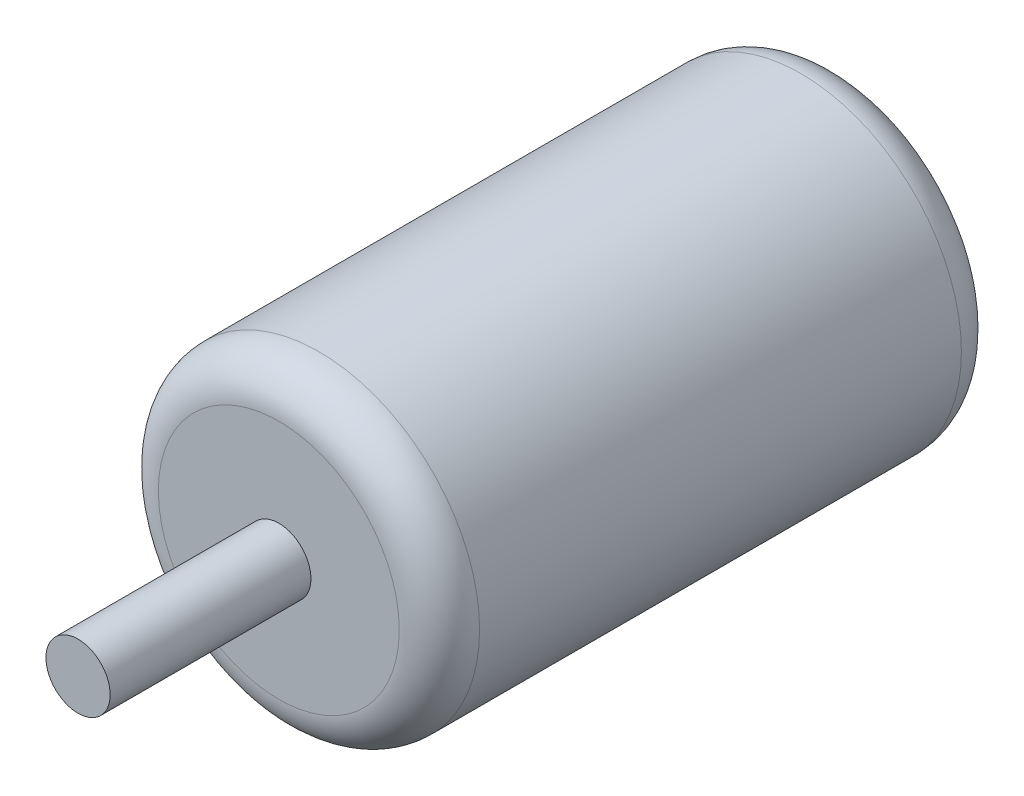
ISO-10303-21;
HEADER;
FILE_DESCRIPTION(('STEP AP214'),'2;1');
FILE_NAME('part.step','',(''),(''),'','','');
FILE_SCHEMA(('AUTOMOTIVE_DESIGN { 1 0 10303 214 1 1 1 1 }'));
ENDSEC;
DATA;
#1=APPLICATION_CONTEXT('core data for automotive mechanical design processes');
#2=APPLICATION_PROTOCOL_DEFINITION('international standard','automotive_design',2000,#1);
#3=PRODUCT_CONTEXT('',#1,'mechanical');
#4=PRODUCT('Part','Part','',(#3));
#5=PRODUCT_RELATED_PRODUCT_CATEGORY('part','',(#4));
#6=PRODUCT_DEFINITION_FORMATION('','',#4);
#7=PRODUCT_DEFINITION_CONTEXT('part definition',#1,'design');
#8=PRODUCT_DEFINITION('design','',#6,#7);
#9=PRODUCT_DEFINITION_SHAPE('','',#8);
#10=(LENGTH_UNIT() NAMED_UNIT(*) SI_UNIT(.MILLI.,.METRE.));
#11=(NAMED_UNIT(*) PLANE_ANGLE_UNIT() SI_UNIT($,.RADIAN.));
#12=(NAMED_UNIT(*) SI_UNIT($,.STERADIAN.) SOLID_ANGLE_UNIT());
#13=UNCERTAINTY_MEASURE_WITH_UNIT(LENGTH_MEASURE(1.E-05),#10,'distance_accuracy_value','');
#14=(GEOMETRIC_REPRESENTATION_CONTEXT(3) GLOBAL_UNCERTAINTY_ASSIGNED_CONTEXT((#13)) GLOBAL_UNIT_ASSIGNED_CONTEXT((#10,
#11,#12)) REPRESENTATION_CONTEXT('',''));
#15=CARTESIAN_POINT('',(0.,0.,0.));
#16=DIRECTION('',(0.,0.,1.));
#17=DIRECTION('',(1.,0.,0.));
#18=AXIS2_PLACEMENT_3D('',#15,#16,#17);
#19=CARTESIAN_POINT('',(0.,0.,70.));
#20=DIRECTION('',(0.,0.,-1.));
#21=DIRECTION('',(-1.,0.,0.));
#22=AXIS2_PLACEMENT_3D('',#19,#20,#21);
#23=CYLINDRICAL_SURFACE('',#22,20.);
#24=CARTESIAN_POINT('',(0.,0.,5.));
#25=DIRECTION('',(0.,0.,1.));
#26=DIRECTION('',(1.,0.,0.));
#27=AXIS2_PLACEMENT_3D('',#24,#25,#26);
#28=CIRCLE('',#27,20.);
#29=CARTESIAN_POINT('',(20.,0.,5.));
#30=VERTEX_POINT('',#29);
#31=EDGE_CURVE('E42',#30,#30,#28,.T.);
#32=ORIENTED_EDGE('',*,*,#31,.T.);
#33=EDGE_LOOP('',(#32));
#34=FACE_BOUND('',#33,.T.);
#35=CARTESIAN_POINT('',(0.,0.,65.));
#36=DIRECTION('',(0.,0.,1.));
#37=DIRECTION('',(1.,0.,0.));
#38=AXIS2_PLACEMENT_3D('',#35,#36,#37);
#39=CIRCLE('',#38,20.);
#40=CARTESIAN_POINT('',(20.,0.,65.));
#41=VERTEX_POINT('',#40);
#42=EDGE_CURVE('E46',#41,#41,#39,.F.);
#43=ORIENTED_EDGE('',*,*,#42,.T.);
#44=EDGE_LOOP('',(#43));
#45=FACE_BOUND('',#44,.T.);
#46=ADVANCED_FACE('F31',(#34,#45),#23,.T.);
#47=CARTESIAN_POINT('',(0.,0.,70.));
#48=DIRECTION('',(0.,0.,1.));
#49=DIRECTION('',(1.,0.,0.));
#50=AXIS2_PLACEMENT_3D('',#47,#48,#49);
#51=PLANE('',#50);
#52=CARTESIAN_POINT('',(0.,0.,70.));
#53=DIRECTION('',(0.,0.,1.));
#54=DIRECTION('',(1.,0.,0.));
#55=AXIS2_PLACEMENT_3D('',#52,#53,#54);
#56=CIRCLE('',#55,15.);
#57=CARTESIAN_POINT('',(15.,0.,70.));
#58=VERTEX_POINT('',#57);
#59=EDGE_CURVE('E10',#58,#58,#56,.T.);
#60=ORIENTED_EDGE('',*,*,#59,.T.);
#61=EDGE_LOOP('',(#60));
#62=FACE_BOUND('',#61,.T.);
#63=CARTESIAN_POINT('',(0.,0.,70.));
#64=DIRECTION('',(0.,0.,1.));
#65=DIRECTION('',(1.,0.,0.));
#66=AXIS2_PLACEMENT_3D('',#63,#64,#65);
#67=CIRCLE('',#66,4.);
#68=CARTESIAN_POINT('',(4.,0.,70.));
#69=VERTEX_POINT('',#68);
#70=EDGE_CURVE('E51',#69,#69,#67,.T.);
#71=ORIENTED_EDGE('',*,*,#70,.F.);
#72=EDGE_LOOP('',(#71));
#73=FACE_BOUND('',#72,.T.);
#74=ADVANCED_FACE('F67',(#62,#73),#51,.T.);
#75=CARTESIAN_POINT('',(0.,0.,0.));
#76=DIRECTION('',(0.,0.,1.));
#77=DIRECTION('',(1.,0.,0.));
#78=AXIS2_PLACEMENT_3D('',#75,#76,#77);
#79=PLANE('',#78);
#80=CARTESIAN_POINT('',(0.,0.,0.));
#81=DIRECTION('',(0.,0.,1.));
#82=DIRECTION('',(1.,0.,0.));
#83=AXIS2_PLACEMENT_3D('',#80,#81,#82);
#84=CIRCLE('',#83,15.);
#85=CARTESIAN_POINT('',(15.,0.,0.));
#86=VERTEX_POINT('',#85);
#87=EDGE_CURVE('E38',#86,#86,#84,.F.);
#88=ORIENTED_EDGE('',*,*,#87,.T.);
#89=EDGE_LOOP('',(#88));
#90=FACE_BOUND('',#89,.T.);
#91=ADVANCED_FACE('F63',(#90),#79,.F.);
#92=CARTESIAN_POINT('',(0.,0.,95.));
#93=DIRECTION('',(0.,0.,-1.));
#94=DIRECTION('',(-1.,0.,0.));
#95=AXIS2_PLACEMENT_3D('',#92,#93,#94);
#96=CYLINDRICAL_SURFACE('',#95,4.);
#97=CARTESIAN_POINT('',(0.,0.,95.));
#98=DIRECTION('',(0.,0.,1.));
#99=DIRECTION('',(1.,0.,0.));
#100=AXIS2_PLACEMENT_3D('',#97,#98,#99);
#101=CIRCLE('',#100,4.);
#102=CARTESIAN_POINT('',(4.,0.,95.));
#103=VERTEX_POINT('',#102);
#104=EDGE_CURVE('E54',#103,#103,#101,.T.);
#105=ORIENTED_EDGE('',*,*,#104,.F.);
#106=EDGE_LOOP('',(#105));
#107=FACE_BOUND('',#106,.T.);
#108=ORIENTED_EDGE('',*,*,#70,.T.);
#109=EDGE_LOOP('',(#108));
#110=FACE_BOUND('',#109,.T.);
#111=ADVANCED_FACE('F60',(#107,#110),#96,.T.);
#112=CARTESIAN_POINT('',(0.,0.,95.));
#113=DIRECTION('',(0.,0.,1.));
#114=DIRECTION('',(1.,0.,0.));
#115=AXIS2_PLACEMENT_3D('',#112,#113,#114);
#116=PLANE('',#115);
#117=ORIENTED_EDGE('',*,*,#104,.T.);
#118=EDGE_LOOP('',(#117));
#119=FACE_BOUND('',#118,.T.);
#120=ADVANCED_FACE('F58',(#119),#116,.T.);
#121=CARTESIAN_POINT('',(0.,0.,5.));
#122=DIRECTION('',(0.,0.,1.));
#123=DIRECTION('',(1.,0.,0.));
#124=AXIS2_PLACEMENT_3D('',#121,#122,#123);
#125=TOROIDAL_SURFACE('',#124,15.,5.);
#126=ORIENTED_EDGE('',*,*,#87,.F.);
#127=EDGE_LOOP('',(#126));
#128=FACE_BOUND('',#127,.T.);
#129=ORIENTED_EDGE('',*,*,#31,.F.);
#130=EDGE_LOOP('',(#129));
#131=FACE_BOUND('',#130,.T.);
#132=ADVANCED_FACE('F78',(#128,#131),#125,.T.);
#133=CARTESIAN_POINT('',(0.,0.,65.));
#134=DIRECTION('',(0.,0.,1.));
#135=DIRECTION('',(1.,0.,0.));
#136=AXIS2_PLACEMENT_3D('',#133,#134,#135);
#137=TOROIDAL_SURFACE('',#136,15.,5.);
#138=ORIENTED_EDGE('',*,*,#42,.F.);
#139=EDGE_LOOP('',(#138));
#140=FACE_BOUND('',#139,.T.);
#141=ORIENTED_EDGE('',*,*,#59,.F.);
#142=EDGE_LOOP('',(#141));
#143=FACE_BOUND('',#142,.T.);
#144=ADVANCED_FACE('F33',(#140,#143),#137,.T.);
#145=CLOSED_SHELL('',(#46,#74,#91,#111,#120,#132,#144));
#146=MANIFOLD_SOLID_BREP('B2',#145);
#147=ADVANCED_BREP_SHAPE_REPRESENTATION('',(#18,#146),#14);
#148=SHAPE_DEFINITION_REPRESENTATION(#9,#147);
ENDSEC;
END-ISO-10303-21;
